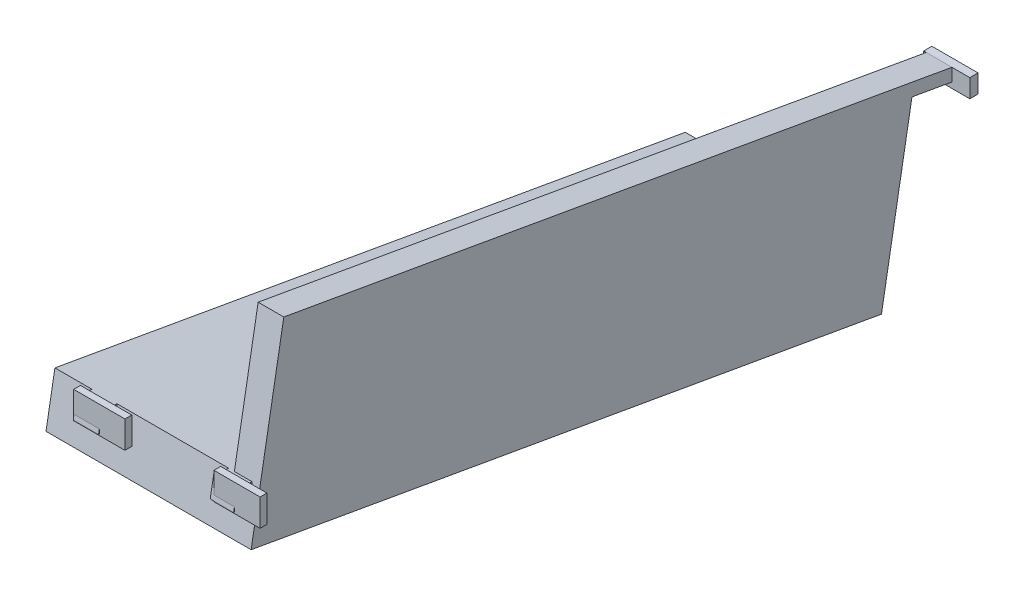
ISO-10303-21;
HEADER;
FILE_DESCRIPTION(('STEP AP214'),'2;1');
FILE_NAME('part.step','',(''),(''),'','','');
FILE_SCHEMA(('AUTOMOTIVE_DESIGN { 1 0 10303 214 1 1 1 1 }'));
ENDSEC;
DATA;
#1=APPLICATION_CONTEXT('core data for automotive mechanical design processes');
#2=APPLICATION_PROTOCOL_DEFINITION('international standard','automotive_design',2000,#1);
#3=PRODUCT_CONTEXT('',#1,'mechanical');
#4=PRODUCT('Part','Part','',(#3));
#5=PRODUCT_RELATED_PRODUCT_CATEGORY('part','',(#4));
#6=PRODUCT_DEFINITION_FORMATION('','',#4);
#7=PRODUCT_DEFINITION_CONTEXT('part definition',#1,'design');
#8=PRODUCT_DEFINITION('design','',#6,#7);
#9=PRODUCT_DEFINITION_SHAPE('','',#8);
#10=(LENGTH_UNIT() NAMED_UNIT(*) SI_UNIT(.MILLI.,.METRE.));
#11=(NAMED_UNIT(*) PLANE_ANGLE_UNIT() SI_UNIT($,.RADIAN.));
#12=(NAMED_UNIT(*) SI_UNIT($,.STERADIAN.) SOLID_ANGLE_UNIT());
#13=UNCERTAINTY_MEASURE_WITH_UNIT(LENGTH_MEASURE(1.E-05),#10,'distance_accuracy_value','');
#14=(GEOMETRIC_REPRESENTATION_CONTEXT(3) GLOBAL_UNCERTAINTY_ASSIGNED_CONTEXT((#13)) GLOBAL_UNIT_ASSIGNED_CONTEXT((#10,
#11,#12)) REPRESENTATION_CONTEXT('',''));
#15=CARTESIAN_POINT('',(0.,0.,0.));
#16=DIRECTION('',(0.,0.,1.));
#17=DIRECTION('',(1.,0.,0.));
#18=AXIS2_PLACEMENT_3D('',#15,#16,#17);
#19=CARTESIAN_POINT('',(72.3326180453818,5.20944533000809,29.5442325903662));
#20=DIRECTION('',(1.,0.,0.));
#21=DIRECTION('',(0.,0.,-1.));
#22=AXIS2_PLACEMENT_3D('',#19,#20,#21);
#23=PLANE('',#22);
#24=DIRECTION('',(0.,-0.173648177666936,-0.984807753012207));
#25=VECTOR('',#24,1.);
#26=CARTESIAN_POINT('',(72.3326180453818,-33.4961910673324,36.3690805927092));
#27=LINE('',#26,#25);
#28=CARTESIAN_POINT('',(72.3326180453818,-36.1009137323364,21.5969642975261));
#29=VERTEX_POINT('',#28);
#30=CARTESIAN_POINT('',(72.3326180453818,-38.7056363973405,6.82484800234295));
#31=VERTEX_POINT('',#30);
#32=EDGE_CURVE('E459',#29,#31,#27,.T.);
#33=ORIENTED_EDGE('',*,*,#32,.F.);
#34=DIRECTION('',(0.,1.,0.));
#35=VECTOR('',#34,1.);
#36=CARTESIAN_POINT('',(72.3326180453818,5.20944533000809,21.5969642975261));
#37=LINE('',#36,#35);
#38=CARTESIAN_POINT('',(72.3326180453818,3.80812750705137,21.5969642975261));
#39=VERTEX_POINT('',#38);
#40=EDGE_CURVE('E312',#29,#39,#37,.T.);
#41=ORIENTED_EDGE('',*,*,#40,.T.);
#42=DIRECTION('',(0.,-0.173648177666936,-0.984807753012207));
#43=VECTOR('',#42,1.);
#44=CARTESIAN_POINT('',(72.3326180453818,5.20944533000809,29.5442325903662));
#45=LINE('',#44,#43);
#46=CARTESIAN_POINT('',(72.3326180453818,0.,0.));
#47=VERTEX_POINT('',#46);
#48=EDGE_CURVE('E444',#39,#47,#45,.T.);
#49=ORIENTED_EDGE('',*,*,#48,.T.);
#50=DIRECTION('',(0.,-0.984807753012207,0.173648177666936));
#51=VECTOR('',#50,1.);
#52=CARTESIAN_POINT('',(72.3326180453818,0.,0.));
#53=LINE('',#52,#51);
#54=EDGE_CURVE('E436',#47,#31,#53,.T.);
#55=ORIENTED_EDGE('',*,*,#54,.T.);
#56=EDGE_LOOP('',(#33,#41,#49,#55));
#57=FACE_BOUND('',#56,.T.);
#58=ADVANCED_FACE('F33',(#57),#23,.F.);
#59=CARTESIAN_POINT('',(72.3326180453818,-33.4961910673324,36.3690805927092));
#60=DIRECTION('',(0.,0.984807753012207,-0.173648177666936));
#61=DIRECTION('',(0.,0.173648177666936,0.984807753012207));
#62=AXIS2_PLACEMENT_3D('',#59,#60,#61);
#63=PLANE('',#62);
#64=DIRECTION('',(0.,-0.173648177666936,-0.984807753012207));
#65=VECTOR('',#64,1.);
#66=CARTESIAN_POINT('',(121.466483363949,-33.4961910673324,36.3690805927092));
#67=LINE('',#66,#65);
#68=CARTESIAN_POINT('',(121.466483363949,-36.1009137323365,21.596964297526));
#69=VERTEX_POINT('',#68);
#70=CARTESIAN_POINT('',(121.466483363949,-38.7056363973405,6.82484800234295));
#71=VERTEX_POINT('',#70);
#72=EDGE_CURVE('E455',#69,#71,#67,.T.);
#73=ORIENTED_EDGE('',*,*,#72,.F.);
#74=DIRECTION('',(1.,0.,0.));
#75=VECTOR('',#74,1.);
#76=CARTESIAN_POINT('',(71.4664833639492,-36.1009137323364,21.5969642975261));
#77=LINE('',#76,#75);
#78=EDGE_CURVE('E56',#29,#69,#77,.T.);
#79=ORIENTED_EDGE('',*,*,#78,.F.);
#80=ORIENTED_EDGE('',*,*,#32,.T.);
#81=DIRECTION('',(1.,0.,0.));
#82=VECTOR('',#81,1.);
#83=CARTESIAN_POINT('',(72.3326180453818,-38.7056363973405,6.82484800234295));
#84=LINE('',#83,#82);
#85=EDGE_CURVE('E447',#31,#71,#84,.T.);
#86=ORIENTED_EDGE('',*,*,#85,.T.);
#87=EDGE_LOOP('',(#73,#79,#80,#86));
#88=FACE_BOUND('',#87,.T.);
#89=ADVANCED_FACE('F549',(#88),#63,.F.);
#90=CARTESIAN_POINT('',(121.466483363949,5.20944533000809,29.5442325903662));
#91=DIRECTION('',(-1.,0.,0.));
#92=DIRECTION('',(0.,0.,1.));
#93=AXIS2_PLACEMENT_3D('',#90,#91,#92);
#94=PLANE('',#93);
#95=DIRECTION('',(0.,-0.173648177666936,-0.984807753012207));
#96=VECTOR('',#95,1.);
#97=CARTESIAN_POINT('',(121.466483363949,5.20944533000809,29.5442325903662));
#98=LINE('',#97,#96);
#99=CARTESIAN_POINT('',(121.466483363949,3.80812750705142,21.5969642975261));
#100=VERTEX_POINT('',#99);
#101=CARTESIAN_POINT('',(121.466483363949,0.,0.));
#102=VERTEX_POINT('',#101);
#103=EDGE_CURVE('E453',#100,#102,#98,.T.);
#104=ORIENTED_EDGE('',*,*,#103,.F.);
#105=DIRECTION('',(0.,-1.,0.));
#106=VECTOR('',#105,1.);
#107=CARTESIAN_POINT('',(121.466483363949,5.20944533000809,21.5969642975261));
#108=LINE('',#107,#106);
#109=EDGE_CURVE('E11',#100,#69,#108,.T.);
#110=ORIENTED_EDGE('',*,*,#109,.T.);
#111=ORIENTED_EDGE('',*,*,#72,.T.);
#112=DIRECTION('',(0.,0.984807753012207,-0.173648177666936));
#113=VECTOR('',#112,1.);
#114=CARTESIAN_POINT('',(121.466483363949,0.,0.));
#115=LINE('',#114,#113);
#116=EDGE_CURVE('E440',#71,#102,#115,.T.);
#117=ORIENTED_EDGE('',*,*,#116,.T.);
#118=EDGE_LOOP('',(#104,#110,#111,#117));
#119=FACE_BOUND('',#118,.T.);
#120=ADVANCED_FACE('F543',(#119),#94,.F.);
#121=CARTESIAN_POINT('',(384.901351679084,5.2094453300081,29.5442325903662));
#122=DIRECTION('',(-1.,0.,0.));
#123=DIRECTION('',(0.,0.,1.));
#124=AXIS2_PLACEMENT_3D('',#121,#122,#123);
#125=PLANE('',#124);
#126=DIRECTION('',(0.,-0.173648177666936,-0.984807753012207));
#127=VECTOR('',#126,1.);
#128=CARTESIAN_POINT('',(384.901351679084,5.2094453300081,29.5442325903662));
#129=LINE('',#128,#127);
#130=CARTESIAN_POINT('',(384.901351679084,3.80812750705144,21.5969642975261));
#131=VERTEX_POINT('',#130);
#132=CARTESIAN_POINT('',(384.901351679084,0.,0.));
#133=VERTEX_POINT('',#132);
#134=EDGE_CURVE('E427',#131,#133,#129,.T.);
#135=ORIENTED_EDGE('',*,*,#134,.F.);
#136=DIRECTION('',(0.,-1.,0.));
#137=VECTOR('',#136,1.);
#138=CARTESIAN_POINT('',(384.901351679084,5.2094453300081,21.5969642975261));
#139=LINE('',#138,#137);
#140=CARTESIAN_POINT('',(384.901351679084,-36.1009137323364,21.5969642975261));
#141=VERTEX_POINT('',#140);
#142=EDGE_CURVE('E521',#131,#141,#139,.T.);
#143=ORIENTED_EDGE('',*,*,#142,.T.);
#144=DIRECTION('',(0.,-0.173648177666936,-0.984807753012207));
#145=VECTOR('',#144,1.);
#146=CARTESIAN_POINT('',(384.901351679084,-33.4961910673324,36.3690805927092));
#147=LINE('',#146,#145);
#148=CARTESIAN_POINT('',(384.901351679084,-38.7056363973405,6.82484800234294));
#149=VERTEX_POINT('',#148);
#150=EDGE_CURVE('E429',#141,#149,#147,.T.);
#151=ORIENTED_EDGE('',*,*,#150,.T.);
#152=DIRECTION('',(0.,0.984807753012207,-0.173648177666936));
#153=VECTOR('',#152,1.);
#154=CARTESIAN_POINT('',(384.901351679084,0.,0.));
#155=LINE('',#154,#153);
#156=EDGE_CURVE('E420',#149,#133,#155,.T.);
#157=ORIENTED_EDGE('',*,*,#156,.T.);
#158=EDGE_LOOP('',(#135,#143,#151,#157));
#159=FACE_BOUND('',#158,.T.);
#160=ADVANCED_FACE('F552',(#159),#125,.F.);
#161=CARTESIAN_POINT('',(350.,-98.4807753012209,17.3648177666936));
#162=DIRECTION('',(0.,-0.173648177666936,-0.984807753012207));
#163=DIRECTION('',(0.,0.984807753012207,-0.173648177666936));
#164=AXIS2_PLACEMENT_3D('',#161,#162,#163);
#165=PLANE('',#164);
#166=DIRECTION('',(0.,-0.984807753012207,0.173648177666936));
#167=VECTOR('',#166,1.);
#168=CARTESIAN_POINT('',(339.252878336231,0.,0.));
#169=LINE('',#168,#167);
#170=CARTESIAN_POINT('',(339.252878336231,0.,0.));
#171=VERTEX_POINT('',#170);
#172=CARTESIAN_POINT('',(339.252878336231,-38.7056363973405,6.82484800234294));
#173=VERTEX_POINT('',#172);
#174=EDGE_CURVE('E402',#171,#173,#169,.T.);
#175=ORIENTED_EDGE('',*,*,#174,.F.);
#176=DIRECTION('',(-1.,0.,0.));
#177=VECTOR('',#176,1.);
#178=CARTESIAN_POINT('',(350.,0.,0.));
#179=LINE('',#178,#177);
#180=EDGE_CURVE('E504',#171,#102,#179,.T.);
#181=ORIENTED_EDGE('',*,*,#180,.T.);
#182=ORIENTED_EDGE('',*,*,#116,.F.);
#183=ORIENTED_EDGE('',*,*,#85,.F.);
#184=ORIENTED_EDGE('',*,*,#54,.F.);
#185=CARTESIAN_POINT('',(0.,0.,0.));
#186=VERTEX_POINT('',#185);
#187=EDGE_CURVE('E494',#47,#186,#179,.T.);
#188=ORIENTED_EDGE('',*,*,#187,.T.);
#189=DIRECTION('',(0.,-0.984807753012207,0.173648177666936));
#190=VECTOR('',#189,1.);
#191=CARTESIAN_POINT('',(0.,-98.4807753012209,17.3648177666936));
#192=LINE('',#191,#190);
#193=CARTESIAN_POINT('',(0.,-98.4807753012209,17.3648177666936));
#194=VERTEX_POINT('',#193);
#195=EDGE_CURVE('E491',#186,#194,#192,.T.);
#196=ORIENTED_EDGE('',*,*,#195,.T.);
#197=DIRECTION('',(-1.,0.,0.));
#198=VECTOR('',#197,1.);
#199=CARTESIAN_POINT('',(350.,-98.4807753012209,17.3648177666936));
#200=LINE('',#199,#198);
#201=CARTESIAN_POINT('',(400.,-98.480775301221,17.364817766693));
#202=VERTEX_POINT('',#201);
#203=EDGE_CURVE('E513',#202,#194,#200,.T.);
#204=ORIENTED_EDGE('',*,*,#203,.F.);
#205=DIRECTION('',(0.,-0.984807753012208,0.17364817766693));
#206=VECTOR('',#205,1.);
#207=CARTESIAN_POINT('',(400.,-98.480775301221,17.364817766693));
#208=LINE('',#207,#206);
#209=CARTESIAN_POINT('',(400.,262.797961946476,-46.3383711663604));
#210=VERTEX_POINT('',#209);
#211=EDGE_CURVE('E479',#210,#202,#208,.T.);
#212=ORIENTED_EDGE('',*,*,#211,.F.);
#213=DIRECTION('',(-1.,0.,0.));
#214=VECTOR('',#213,1.);
#215=CARTESIAN_POINT('',(400.,262.797961946476,-46.3383711663604));
#216=LINE('',#215,#214);
#217=CARTESIAN_POINT('',(350.,262.797961946476,-46.3383711663604));
#218=VERTEX_POINT('',#217);
#219=EDGE_CURVE('E482',#210,#218,#216,.T.);
#220=ORIENTED_EDGE('',*,*,#219,.T.);
#221=DIRECTION('',(0.,-0.984807753012208,0.17364817766693));
#222=VECTOR('',#221,1.);
#223=CARTESIAN_POINT('',(350.,-98.480775301221,17.364817766693));
#224=LINE('',#223,#222);
#225=CARTESIAN_POINT('',(350.,0.,-1.17226610867137E-13));
#226=VERTEX_POINT('',#225);
#227=EDGE_CURVE('E474',#218,#226,#224,.T.);
#228=ORIENTED_EDGE('',*,*,#227,.T.);
#229=DIRECTION('',(-1.,0.,0.));
#230=VECTOR('',#229,1.);
#231=CARTESIAN_POINT('',(339.252878336231,0.,0.));
#232=LINE('',#231,#230);
#233=EDGE_CURVE('E407',#133,#226,#232,.T.);
#234=ORIENTED_EDGE('',*,*,#233,.F.);
#235=ORIENTED_EDGE('',*,*,#156,.F.);
#236=DIRECTION('',(1.,0.,0.));
#237=VECTOR('',#236,1.);
#238=CARTESIAN_POINT('',(339.252878336231,-38.7056363973405,6.82484800234295));
#239=LINE('',#238,#237);
#240=EDGE_CURVE('E417',#173,#149,#239,.T.);
#241=ORIENTED_EDGE('',*,*,#240,.F.);
#242=EDGE_LOOP('',(#175,#181,#182,#183,#184,#188,#196,#204,#212,#220,#228,#234,#235,#241));
#243=FACE_BOUND('',#242,.T.);
#244=ADVANCED_FACE('F35',(#243),#165,.F.);
#245=CARTESIAN_POINT('',(350.,-216.747655363867,-1229.23703730984));
#246=DIRECTION('',(0.,0.173648177666932,0.984807753012208));
#247=DIRECTION('',(0.,-0.984807753012208,0.173648177666932));
#248=AXIS2_PLACEMENT_3D('',#245,#246,#247);
#249=PLANE('',#248);
#250=DIRECTION('',(-1.,0.,0.));
#251=VECTOR('',#250,1.);
#252=CARTESIAN_POINT('',(400.,21.9145335988968,-1271.31962049891));
#253=LINE('',#252,#251);
#254=CARTESIAN_POINT('',(400.,21.914533598897,-1271.31962049891));
#255=VERTEX_POINT('',#254);
#256=CARTESIAN_POINT('',(350.,21.9145335988968,-1271.31962049891));
#257=VERTEX_POINT('',#256);
#258=EDGE_CURVE('E462',#255,#257,#253,.T.);
#259=ORIENTED_EDGE('',*,*,#258,.F.);
#260=DIRECTION('',(0.,0.984807753012208,-0.173648177666929));
#261=VECTOR('',#260,1.);
#262=CARTESIAN_POINT('',(400.,-315.228430665084,-1211.87221954314));
#263=LINE('',#262,#261);
#264=CARTESIAN_POINT('',(400.,-315.228430665084,-1211.87221954314));
#265=VERTEX_POINT('',#264);
#266=EDGE_CURVE('E473',#265,#255,#263,.T.);
#267=ORIENTED_EDGE('',*,*,#266,.F.);
#268=DIRECTION('',(-1.,0.,0.));
#269=VECTOR('',#268,1.);
#270=CARTESIAN_POINT('',(350.,-315.228430665084,-1211.87221954314));
#271=LINE('',#270,#269);
#272=CARTESIAN_POINT('',(0.,-315.228430665084,-1211.87221954314));
#273=VERTEX_POINT('',#272);
#274=EDGE_CURVE('E510',#265,#273,#271,.T.);
#275=ORIENTED_EDGE('',*,*,#274,.T.);
#276=DIRECTION('',(0.,0.984807753012208,-0.173648177666932));
#277=VECTOR('',#276,1.);
#278=CARTESIAN_POINT('',(0.,-216.747655363867,-1229.23703730984));
#279=LINE('',#278,#277);
#280=CARTESIAN_POINT('',(0.,-216.747655363867,-1229.23703730984));
#281=VERTEX_POINT('',#280);
#282=EDGE_CURVE('E500',#273,#281,#279,.T.);
#283=ORIENTED_EDGE('',*,*,#282,.T.);
#284=DIRECTION('',(-1.,0.,0.));
#285=VECTOR('',#284,1.);
#286=CARTESIAN_POINT('',(350.,-216.747655363867,-1229.23703730984));
#287=LINE('',#286,#285);
#288=CARTESIAN_POINT('',(350.,-216.747655363867,-1229.23703730984));
#289=VERTEX_POINT('',#288);
#290=EDGE_CURVE('E507',#289,#281,#287,.T.);
#291=ORIENTED_EDGE('',*,*,#290,.F.);
#292=DIRECTION('',(0.,0.984807753012208,-0.173648177666929));
#293=VECTOR('',#292,1.);
#294=CARTESIAN_POINT('',(350.,-315.228430665084,-1211.87221954314));
#295=LINE('',#294,#293);
#296=EDGE_CURVE('E469',#289,#257,#295,.T.);
#297=ORIENTED_EDGE('',*,*,#296,.T.);
#298=EDGE_LOOP('',(#259,#267,#275,#283,#291,#297));
#299=FACE_BOUND('',#298,.T.);
#300=ADVANCED_FACE('F890',(#299),#249,.F.);
#301=CARTESIAN_POINT('',(350.,-315.228430665084,-1211.87221954314));
#302=DIRECTION('',(0.,0.984807753012208,-0.173648177666931));
#303=DIRECTION('',(0.,0.173648177666931,0.984807753012208));
#304=AXIS2_PLACEMENT_3D('',#301,#302,#303);
#305=PLANE('',#304);
#306=DIRECTION('',(0.,-0.173648177666931,-0.984807753012208));
#307=VECTOR('',#306,1.);
#308=CARTESIAN_POINT('',(0.,-315.228430665084,-1211.87221954314));
#309=LINE('',#308,#307);
#310=EDGE_CURVE('E498',#194,#273,#309,.T.);
#311=ORIENTED_EDGE('',*,*,#310,.T.);
#312=ORIENTED_EDGE('',*,*,#274,.F.);
#313=DIRECTION('',(0.,-0.173648177666931,-0.984807753012208));
#314=VECTOR('',#313,1.);
#315=CARTESIAN_POINT('',(400.,-98.480775301221,17.364817766693));
#316=LINE('',#315,#314);
#317=EDGE_CURVE('E470',#202,#265,#316,.T.);
#318=ORIENTED_EDGE('',*,*,#317,.F.);
#319=ORIENTED_EDGE('',*,*,#203,.T.);
#320=EDGE_LOOP('',(#311,#312,#318,#319));
#321=FACE_BOUND('',#320,.T.);
#322=ADVANCED_FACE('F648',(#321),#305,.F.);
#323=CARTESIAN_POINT('',(350.,0.,0.));
#324=DIRECTION('',(0.,-0.984807753012207,0.173648177666934));
#325=DIRECTION('',(0.,-0.173648177666934,-0.984807753012208));
#326=AXIS2_PLACEMENT_3D('',#323,#324,#325);
#327=PLANE('',#326);
#328=ORIENTED_EDGE('',*,*,#48,.F.);
#329=DIRECTION('',(1.,0.,0.));
#330=VECTOR('',#329,1.);
#331=CARTESIAN_POINT('',(350.,3.80812750705137,21.5969642975261));
#332=LINE('',#331,#330);
#333=EDGE_CURVE('E309',#39,#100,#332,.T.);
#334=ORIENTED_EDGE('',*,*,#333,.T.);
#335=ORIENTED_EDGE('',*,*,#103,.T.);
#336=ORIENTED_EDGE('',*,*,#180,.F.);
#337=DIRECTION('',(0.,-0.173648177666936,-0.984807753012207));
#338=VECTOR('',#337,1.);
#339=CARTESIAN_POINT('',(339.252878336231,5.2094453300081,29.5442325903662));
#340=LINE('',#339,#338);
#341=CARTESIAN_POINT('',(339.252878336231,5.2094453300081,29.5442325903662));
#342=VERTEX_POINT('',#341);
#343=EDGE_CURVE('E414',#342,#171,#340,.T.);
#344=ORIENTED_EDGE('',*,*,#343,.F.);
#345=DIRECTION('',(-1.,0.,0.));
#346=VECTOR('',#345,1.);
#347=CARTESIAN_POINT('',(339.252878336231,5.2094453300081,29.5442325903662));
#348=LINE('',#347,#346);
#349=CARTESIAN_POINT('',(344.901351679084,5.2094453300081,29.5442325903662));
#350=VERTEX_POINT('',#349);
#351=EDGE_CURVE('E412',#350,#342,#348,.T.);
#352=ORIENTED_EDGE('',*,*,#351,.F.);
#353=DIRECTION('',(0.,0.173648177666934,0.984807753012208));
#354=VECTOR('',#353,1.);
#355=CARTESIAN_POINT('',(344.901351679084,0.,0.));
#356=LINE('',#355,#354);
#357=CARTESIAN_POINT('',(344.901351679084,3.80812750705136,21.5969642975261));
#358=VERTEX_POINT('',#357);
#359=EDGE_CURVE('E383',#358,#350,#356,.T.);
#360=ORIENTED_EDGE('',*,*,#359,.F.);
#361=DIRECTION('',(1.,0.,0.));
#362=VECTOR('',#361,1.);
#363=CARTESIAN_POINT('',(350.,3.80812750705137,21.5969642975261));
#364=LINE('',#363,#362);
#365=EDGE_CURVE('E399',#358,#131,#364,.T.);
#366=ORIENTED_EDGE('',*,*,#365,.T.);
#367=ORIENTED_EDGE('',*,*,#134,.T.);
#368=ORIENTED_EDGE('',*,*,#233,.T.);
#369=DIRECTION('',(0.,0.173648177666934,0.984807753012207));
#370=VECTOR('',#369,1.);
#371=CARTESIAN_POINT('',(350.,0.,0.));
#372=LINE('',#371,#370);
#373=EDGE_CURVE('E492',#289,#226,#372,.T.);
#374=ORIENTED_EDGE('',*,*,#373,.F.);
#375=ORIENTED_EDGE('',*,*,#290,.T.);
#376=DIRECTION('',(0.,0.173648177666934,0.984807753012207));
#377=VECTOR('',#376,1.);
#378=CARTESIAN_POINT('',(0.,0.,0.));
#379=LINE('',#378,#377);
#380=EDGE_CURVE('E495',#281,#186,#379,.T.);
#381=ORIENTED_EDGE('',*,*,#380,.T.);
#382=ORIENTED_EDGE('',*,*,#187,.F.);
#383=EDGE_LOOP('',(#328,#334,#335,#336,#344,#352,#360,#366,#367,#368,#374,#375,#381,#382));
#384=FACE_BOUND('',#383,.T.);
#385=ADVANCED_FACE('F642',(#384),#327,.F.);
#386=CARTESIAN_POINT('',(0.,0.,0.));
#387=DIRECTION('',(-1.,0.,0.));
#388=DIRECTION('',(0.,0.,1.));
#389=AXIS2_PLACEMENT_3D('',#386,#387,#388);
#390=PLANE('',#389);
#391=ORIENTED_EDGE('',*,*,#195,.F.);
#392=ORIENTED_EDGE('',*,*,#380,.F.);
#393=ORIENTED_EDGE('',*,*,#282,.F.);
#394=ORIENTED_EDGE('',*,*,#310,.F.);
#395=EDGE_LOOP('',(#391,#392,#393,#394));
#396=FACE_BOUND('',#395,.T.);
#397=ADVANCED_FACE('F647',(#396),#390,.T.);
#398=CARTESIAN_POINT('',(350.,0.,0.));
#399=DIRECTION('',(1.,0.,0.));
#400=DIRECTION('',(0.,0.,-1.));
#401=AXIS2_PLACEMENT_3D('',#398,#399,#400);
#402=PLANE('',#401);
#403=DIRECTION('',(0.,0.173648177666929,0.984807753012208));
#404=VECTOR('',#403,1.);
#405=CARTESIAN_POINT('',(350.,262.797961946476,-46.3383711663604));
#406=LINE('',#405,#404);
#407=CARTESIAN_POINT('',(350.,33.0638669252756,-1349.22516760643));
#408=VERTEX_POINT('',#407);
#409=EDGE_CURVE('E485',#408,#218,#406,.T.);
#410=ORIENTED_EDGE('',*,*,#409,.F.);
#411=DIRECTION('',(0.,-1.,0.));
#412=VECTOR('',#411,1.);
#413=CARTESIAN_POINT('',(350.,0.,-1349.22516760643));
#414=LINE('',#413,#412);
#415=CARTESIAN_POINT('',(350.,8.17768369698739,-1349.22516760643));
#416=VERTEX_POINT('',#415);
#417=EDGE_CURVE('E352',#408,#416,#414,.T.);
#418=ORIENTED_EDGE('',*,*,#417,.T.);
#419=DIRECTION('',(0.,0.173648177666932,0.984807753012208));
#420=VECTOR('',#419,1.);
#421=CARTESIAN_POINT('',(350.,6.28619760887291,-1359.95231827001));
#422=LINE('',#421,#420);
#423=EDGE_CURVE('E465',#416,#257,#422,.T.);
#424=ORIENTED_EDGE('',*,*,#423,.T.);
#425=ORIENTED_EDGE('',*,*,#296,.F.);
#426=ORIENTED_EDGE('',*,*,#373,.T.);
#427=ORIENTED_EDGE('',*,*,#227,.F.);
#428=EDGE_LOOP('',(#410,#418,#424,#425,#426,#427));
#429=FACE_BOUND('',#428,.T.);
#430=ADVANCED_FACE('F858',(#429),#402,.F.);
#431=CARTESIAN_POINT('',(400.,262.797961946476,-46.3383711663604));
#432=DIRECTION('',(0.,-0.984807753012208,0.173648177666929));
#433=DIRECTION('',(0.,-0.173648177666929,-0.984807753012208));
#434=AXIS2_PLACEMENT_3D('',#431,#432,#433);
#435=PLANE('',#434);
#436=DIRECTION('',(0.,0.173648177666929,0.984807753012208));
#437=VECTOR('',#436,1.);
#438=CARTESIAN_POINT('',(400.,262.797961946476,-46.3383711663604));
#439=LINE('',#438,#437);
#440=CARTESIAN_POINT('',(400.,33.0638669252756,-1349.22516760643));
#441=VERTEX_POINT('',#440);
#442=EDGE_CURVE('E477',#441,#210,#439,.T.);
#443=ORIENTED_EDGE('',*,*,#442,.F.);
#444=DIRECTION('',(1.,0.,0.));
#445=VECTOR('',#444,1.);
#446=CARTESIAN_POINT('',(344.901351679084,33.0638669252756,-1349.22516760643));
#447=LINE('',#446,#445);
#448=EDGE_CURVE('E344',#408,#441,#447,.T.);
#449=ORIENTED_EDGE('',*,*,#448,.F.);
#450=ORIENTED_EDGE('',*,*,#409,.T.);
#451=ORIENTED_EDGE('',*,*,#219,.F.);
#452=EDGE_LOOP('',(#443,#449,#450,#451));
#453=FACE_BOUND('',#452,.T.);
#454=ADVANCED_FACE('F847',(#453),#435,.F.);
#455=CARTESIAN_POINT('',(400.,0.,0.));
#456=DIRECTION('',(1.,0.,0.));
#457=DIRECTION('',(0.,0.,-1.));
#458=AXIS2_PLACEMENT_3D('',#455,#456,#457);
#459=PLANE('',#458);
#460=DIRECTION('',(0.,-1.,0.));
#461=VECTOR('',#460,1.);
#462=CARTESIAN_POINT('',(400.,0.,-1349.22516760643));
#463=LINE('',#462,#461);
#464=CARTESIAN_POINT('',(400.,8.17768369698739,-1349.22516760643));
#465=VERTEX_POINT('',#464);
#466=EDGE_CURVE('E343',#441,#465,#463,.T.);
#467=ORIENTED_EDGE('',*,*,#466,.F.);
#468=ORIENTED_EDGE('',*,*,#442,.T.);
#469=ORIENTED_EDGE('',*,*,#211,.T.);
#470=ORIENTED_EDGE('',*,*,#317,.T.);
#471=ORIENTED_EDGE('',*,*,#266,.T.);
#472=DIRECTION('',(0.,0.173648177666932,0.984807753012208));
#473=VECTOR('',#472,1.);
#474=CARTESIAN_POINT('',(400.,6.28619760887291,-1359.95231827001));
#475=LINE('',#474,#473);
#476=EDGE_CURVE('E467',#465,#255,#475,.T.);
#477=ORIENTED_EDGE('',*,*,#476,.F.);
#478=EDGE_LOOP('',(#467,#468,#469,#470,#471,#477));
#479=FACE_BOUND('',#478,.T.);
#480=ADVANCED_FACE('F837',(#479),#459,.T.);
#481=CARTESIAN_POINT('',(400.,6.28619760887291,-1359.95231827001));
#482=DIRECTION('',(0.,0.984807753012208,-0.173648177666932));
#483=DIRECTION('',(0.,0.173648177666932,0.984807753012208));
#484=AXIS2_PLACEMENT_3D('',#481,#482,#483);
#485=PLANE('',#484);
#486=ORIENTED_EDGE('',*,*,#423,.F.);
#487=DIRECTION('',(1.,0.,0.));
#488=VECTOR('',#487,1.);
#489=CARTESIAN_POINT('',(400.,8.17768369698739,-1349.22516760643));
#490=LINE('',#489,#488);
#491=EDGE_CURVE('E524',#416,#465,#490,.T.);
#492=ORIENTED_EDGE('',*,*,#491,.T.);
#493=ORIENTED_EDGE('',*,*,#476,.T.);
#494=ORIENTED_EDGE('',*,*,#258,.T.);
#495=EDGE_LOOP('',(#486,#492,#493,#494));
#496=FACE_BOUND('',#495,.T.);
#497=ADVANCED_FACE('F832',(#496),#485,.F.);
#498=CARTESIAN_POINT('',(339.252878336231,5.2094453300081,29.5442325903662));
#499=DIRECTION('',(1.,0.,0.));
#500=DIRECTION('',(0.,0.,-1.));
#501=AXIS2_PLACEMENT_3D('',#498,#499,#500);
#502=PLANE('',#501);
#503=ORIENTED_EDGE('',*,*,#174,.T.);
#504=DIRECTION('',(0.,-0.173648177666936,-0.984807753012207));
#505=VECTOR('',#504,1.);
#506=CARTESIAN_POINT('',(339.252878336231,-33.4961910673324,36.3690805927092));
#507=LINE('',#506,#505);
#508=CARTESIAN_POINT('',(339.252878336231,-33.4961910673324,36.3690805927092));
#509=VERTEX_POINT('',#508);
#510=EDGE_CURVE('E433',#509,#173,#507,.T.);
#511=ORIENTED_EDGE('',*,*,#510,.F.);
#512=DIRECTION('',(0.,-0.984807753012207,0.173648177666936));
#513=VECTOR('',#512,1.);
#514=CARTESIAN_POINT('',(339.252878336231,5.2094453300081,29.5442325903662));
#515=LINE('',#514,#513);
#516=EDGE_CURVE('E403',#342,#509,#515,.T.);
#517=ORIENTED_EDGE('',*,*,#516,.F.);
#518=ORIENTED_EDGE('',*,*,#343,.T.);
#519=EDGE_LOOP('',(#503,#511,#517,#518));
#520=FACE_BOUND('',#519,.T.);
#521=ADVANCED_FACE('F825',(#520),#502,.F.);
#522=CARTESIAN_POINT('',(339.252878336231,-33.4961910673324,36.3690805927092));
#523=DIRECTION('',(0.,0.984807753012207,-0.173648177666936));
#524=DIRECTION('',(0.,0.173648177666936,0.984807753012207));
#525=AXIS2_PLACEMENT_3D('',#522,#523,#524);
#526=PLANE('',#525);
#527=ORIENTED_EDGE('',*,*,#150,.F.);
#528=DIRECTION('',(1.,0.,0.));
#529=VECTOR('',#528,1.);
#530=CARTESIAN_POINT('',(344.901351679084,-36.1009137323364,21.5969642975261));
#531=LINE('',#530,#529);
#532=CARTESIAN_POINT('',(344.901351679084,-36.1009137323364,21.5969642975261));
#533=VERTEX_POINT('',#532);
#534=EDGE_CURVE('E380',#533,#141,#531,.T.);
#535=ORIENTED_EDGE('',*,*,#534,.F.);
#536=DIRECTION('',(0.,-0.173648177666936,-0.984807753012207));
#537=VECTOR('',#536,1.);
#538=CARTESIAN_POINT('',(344.901351679084,-33.4961910673324,36.3690805927092));
#539=LINE('',#538,#537);
#540=CARTESIAN_POINT('',(344.901351679084,-33.7642537882558,34.8488213570192));
#541=VERTEX_POINT('',#540);
#542=EDGE_CURVE('E391',#541,#533,#539,.T.);
#543=ORIENTED_EDGE('',*,*,#542,.F.);
#544=DIRECTION('',(1.,0.,0.));
#545=VECTOR('',#544,1.);
#546=CARTESIAN_POINT('',(339.252878336231,-33.7642537882558,34.8488213570192));
#547=LINE('',#546,#545);
#548=CARTESIAN_POINT('',(384.901351679084,-33.7642537882558,34.8488213570192));
#549=VERTEX_POINT('',#548);
#550=EDGE_CURVE('E396',#541,#549,#547,.T.);
#551=ORIENTED_EDGE('',*,*,#550,.T.);
#552=CARTESIAN_POINT('',(384.901351679084,-33.4961910673324,36.3690805927092));
#553=VERTEX_POINT('',#552);
#554=EDGE_CURVE('E430',#553,#549,#147,.T.);
#555=ORIENTED_EDGE('',*,*,#554,.F.);
#556=DIRECTION('',(1.,0.,0.));
#557=VECTOR('',#556,1.);
#558=CARTESIAN_POINT('',(339.252878336231,-33.4961910673324,36.3690805927092));
#559=LINE('',#558,#557);
#560=EDGE_CURVE('E406',#509,#553,#559,.T.);
#561=ORIENTED_EDGE('',*,*,#560,.F.);
#562=ORIENTED_EDGE('',*,*,#510,.T.);
#563=ORIENTED_EDGE('',*,*,#240,.T.);
#564=EDGE_LOOP('',(#527,#535,#543,#551,#555,#561,#562,#563));
#565=FACE_BOUND('',#564,.T.);
#566=ADVANCED_FACE('F815',(#565),#526,.F.);
#567=ORIENTED_EDGE('',*,*,#554,.T.);
#568=DIRECTION('',(0.,1.,0.));
#569=VECTOR('',#568,1.);
#570=CARTESIAN_POINT('',(384.901351679084,5.2094453300081,34.8488213570192));
#571=LINE('',#570,#569);
#572=CARTESIAN_POINT('',(384.901351679084,-24.8743725028585,34.8488213570192));
#573=VERTEX_POINT('',#572);
#574=EDGE_CURVE('E393',#549,#573,#571,.T.);
#575=ORIENTED_EDGE('',*,*,#574,.T.);
#576=DIRECTION('',(0.,0.984807753012207,-0.173648177666936));
#577=VECTOR('',#576,1.);
#578=CARTESIAN_POINT('',(384.901351679084,5.2094453300081,29.5442325903662));
#579=LINE('',#578,#577);
#580=EDGE_CURVE('E409',#553,#573,#579,.T.);
#581=ORIENTED_EDGE('',*,*,#580,.F.);
#582=EDGE_LOOP('',(#567,#575,#581));
#583=FACE_BOUND('',#582,.T.);
#584=ADVANCED_FACE('F805',(#583),#125,.F.);
#585=CARTESIAN_POINT('',(0.,5.20944533000808,29.5442325903662));
#586=DIRECTION('',(0.,0.173648177666936,0.984807753012207));
#587=DIRECTION('',(0.,-0.984807753012207,0.173648177666936));
#588=AXIS2_PLACEMENT_3D('',#585,#586,#587);
#589=PLANE('',#588);
#590=DIRECTION('',(1.,0.,0.));
#591=VECTOR('',#590,1.);
#592=CARTESIAN_POINT('',(0.,-24.8743725028585,34.8488213570192));
#593=LINE('',#592,#591);
#594=CARTESIAN_POINT('',(344.901351679084,-24.8743725028588,34.8488213570193));
#595=VERTEX_POINT('',#594);
#596=EDGE_CURVE('E519',#595,#573,#593,.T.);
#597=ORIENTED_EDGE('',*,*,#596,.F.);
#598=DIRECTION('',(0.,0.984807753012207,-0.173648177666936));
#599=VECTOR('',#598,1.);
#600=CARTESIAN_POINT('',(344.901351679084,5.20944533000808,29.5442325903662));
#601=LINE('',#600,#599);
#602=EDGE_CURVE('E516',#595,#350,#601,.T.);
#603=ORIENTED_EDGE('',*,*,#602,.T.);
#604=ORIENTED_EDGE('',*,*,#351,.T.);
#605=ORIENTED_EDGE('',*,*,#516,.T.);
#606=ORIENTED_EDGE('',*,*,#560,.T.);
#607=ORIENTED_EDGE('',*,*,#580,.T.);
#608=EDGE_LOOP('',(#597,#603,#604,#605,#606,#607));
#609=FACE_BOUND('',#608,.T.);
#610=ADVANCED_FACE('F794',(#609),#589,.T.);
#611=CARTESIAN_POINT('',(344.901351679084,-36.1009137323364,21.5969642975261));
#612=DIRECTION('',(0.,0.,-1.));
#613=DIRECTION('',(-1.,0.,0.));
#614=AXIS2_PLACEMENT_3D('',#611,#612,#613);
#615=PLANE('',#614);
#616=ORIENTED_EDGE('',*,*,#365,.F.);
#617=DIRECTION('',(0.,1.,0.));
#618=VECTOR('',#617,1.);
#619=CARTESIAN_POINT('',(344.901351679084,-36.1009137323364,21.5969642975261));
#620=LINE('',#619,#618);
#621=CARTESIAN_POINT('',(344.901351679084,16.8907112224034,21.5969642975261));
#622=VERTEX_POINT('',#621);
#623=EDGE_CURVE('E367',#358,#622,#620,.T.);
#624=ORIENTED_EDGE('',*,*,#623,.T.);
#625=DIRECTION('',(1.,0.,0.));
#626=VECTOR('',#625,1.);
#627=CARTESIAN_POINT('',(344.901351679084,16.8907112224034,21.5969642975261));
#628=LINE('',#627,#626);
#629=CARTESIAN_POINT('',(434.901351679084,16.8907112224034,21.5969642975261));
#630=VERTEX_POINT('',#629);
#631=EDGE_CURVE('E379',#622,#630,#628,.T.);
#632=ORIENTED_EDGE('',*,*,#631,.T.);
#633=DIRECTION('',(0.,1.,0.));
#634=VECTOR('',#633,1.);
#635=CARTESIAN_POINT('',(434.901351679084,-36.1009137323364,21.5969642975261));
#636=LINE('',#635,#634);
#637=CARTESIAN_POINT('',(434.901351679084,-36.1009137323364,21.5969642975261));
#638=VERTEX_POINT('',#637);
#639=EDGE_CURVE('E355',#638,#630,#636,.T.);
#640=ORIENTED_EDGE('',*,*,#639,.F.);
#641=EDGE_CURVE('E384',#141,#638,#531,.T.);
#642=ORIENTED_EDGE('',*,*,#641,.F.);
#643=ORIENTED_EDGE('',*,*,#142,.F.);
#644=EDGE_LOOP('',(#616,#624,#632,#640,#642,#643));
#645=FACE_BOUND('',#644,.T.);
#646=ADVANCED_FACE('F784',(#645),#615,.T.);
#647=CARTESIAN_POINT('',(344.901351679084,-36.1009137323364,34.8488213570192));
#648=DIRECTION('',(0.,0.,1.));
#649=DIRECTION('',(1.,0.,0.));
#650=AXIS2_PLACEMENT_3D('',#647,#648,#649);
#651=PLANE('',#650);
#652=ORIENTED_EDGE('',*,*,#550,.F.);
#653=DIRECTION('',(0.,-1.,0.));
#654=VECTOR('',#653,1.);
#655=CARTESIAN_POINT('',(344.901351679084,-36.1009137323364,34.8488213570192));
#656=LINE('',#655,#654);
#657=CARTESIAN_POINT('',(344.901351679084,-36.1009137323364,34.8488213570192));
#658=VERTEX_POINT('',#657);
#659=EDGE_CURVE('E372',#541,#658,#656,.T.);
#660=ORIENTED_EDGE('',*,*,#659,.T.);
#661=DIRECTION('',(1.,0.,0.));
#662=VECTOR('',#661,1.);
#663=CARTESIAN_POINT('',(344.901351679084,-36.1009137323364,34.8488213570192));
#664=LINE('',#663,#662);
#665=CARTESIAN_POINT('',(434.901351679084,-36.1009137323364,34.8488213570192));
#666=VERTEX_POINT('',#665);
#667=EDGE_CURVE('E385',#658,#666,#664,.T.);
#668=ORIENTED_EDGE('',*,*,#667,.T.);
#669=DIRECTION('',(0.,-1.,0.));
#670=VECTOR('',#669,1.);
#671=CARTESIAN_POINT('',(434.901351679084,-36.1009137323364,34.8488213570192));
#672=LINE('',#671,#670);
#673=CARTESIAN_POINT('',(434.901351679084,16.8907112224034,34.8488213570192));
#674=VERTEX_POINT('',#673);
#675=EDGE_CURVE('E361',#674,#666,#672,.T.);
#676=ORIENTED_EDGE('',*,*,#675,.F.);
#677=DIRECTION('',(1.,0.,0.));
#678=VECTOR('',#677,1.);
#679=CARTESIAN_POINT('',(344.901351679084,16.8907112224034,34.8488213570192));
#680=LINE('',#679,#678);
#681=CARTESIAN_POINT('',(344.901351679084,16.8907112224034,34.8488213570192));
#682=VERTEX_POINT('',#681);
#683=EDGE_CURVE('E387',#682,#674,#680,.T.);
#684=ORIENTED_EDGE('',*,*,#683,.F.);
#685=EDGE_CURVE('E373',#682,#595,#656,.T.);
#686=ORIENTED_EDGE('',*,*,#685,.T.);
#687=ORIENTED_EDGE('',*,*,#596,.T.);
#688=ORIENTED_EDGE('',*,*,#574,.F.);
#689=EDGE_LOOP('',(#652,#660,#668,#676,#684,#686,#687,#688));
#690=FACE_BOUND('',#689,.T.);
#691=ADVANCED_FACE('F775',(#690),#651,.T.);
#692=CARTESIAN_POINT('',(344.901351679084,0.,0.));
#693=DIRECTION('',(1.,0.,0.));
#694=DIRECTION('',(0.,0.,-1.));
#695=AXIS2_PLACEMENT_3D('',#692,#693,#694);
#696=PLANE('',#695);
#697=ORIENTED_EDGE('',*,*,#659,.F.);
#698=ORIENTED_EDGE('',*,*,#542,.T.);
#699=DIRECTION('',(0.,0.,-1.));
#700=VECTOR('',#699,1.);
#701=CARTESIAN_POINT('',(344.901351679084,-36.1009137323364,21.5969642975261));
#702=LINE('',#701,#700);
#703=EDGE_CURVE('E376',#658,#533,#702,.T.);
#704=ORIENTED_EDGE('',*,*,#703,.F.);
#705=EDGE_LOOP('',(#697,#698,#704));
#706=FACE_BOUND('',#705,.T.);
#707=ADVANCED_FACE('F765',(#706),#696,.F.);
#708=ORIENTED_EDGE('',*,*,#623,.F.);
#709=ORIENTED_EDGE('',*,*,#359,.T.);
#710=ORIENTED_EDGE('',*,*,#602,.F.);
#711=ORIENTED_EDGE('',*,*,#685,.F.);
#712=DIRECTION('',(0.,0.,1.));
#713=VECTOR('',#712,1.);
#714=CARTESIAN_POINT('',(344.901351679084,16.8907112224034,21.5969642975261));
#715=LINE('',#714,#713);
#716=EDGE_CURVE('E369',#622,#682,#715,.T.);
#717=ORIENTED_EDGE('',*,*,#716,.F.);
#718=EDGE_LOOP('',(#708,#709,#710,#711,#717));
#719=FACE_BOUND('',#718,.T.);
#720=ADVANCED_FACE('F755',(#719),#696,.F.);
#721=CARTESIAN_POINT('',(344.901351679084,-36.1009137323364,21.5969642975261));
#722=DIRECTION('',(0.,-1.,0.));
#723=DIRECTION('',(0.,0.,-1.));
#724=AXIS2_PLACEMENT_3D('',#721,#722,#723);
#725=PLANE('',#724);
#726=ORIENTED_EDGE('',*,*,#534,.T.);
#727=ORIENTED_EDGE('',*,*,#641,.T.);
#728=DIRECTION('',(0.,0.,-1.));
#729=VECTOR('',#728,1.);
#730=CARTESIAN_POINT('',(434.901351679084,-36.1009137323364,21.5969642975261));
#731=LINE('',#730,#729);
#732=EDGE_CURVE('E364',#666,#638,#731,.T.);
#733=ORIENTED_EDGE('',*,*,#732,.F.);
#734=ORIENTED_EDGE('',*,*,#667,.F.);
#735=ORIENTED_EDGE('',*,*,#703,.T.);
#736=EDGE_LOOP('',(#726,#727,#733,#734,#735));
#737=FACE_BOUND('',#736,.T.);
#738=ADVANCED_FACE('F745',(#737),#725,.T.);
#739=CARTESIAN_POINT('',(344.901351679084,16.8907112224034,21.5969642975261));
#740=DIRECTION('',(0.,1.,0.));
#741=DIRECTION('',(0.,0.,1.));
#742=AXIS2_PLACEMENT_3D('',#739,#740,#741);
#743=PLANE('',#742);
#744=ORIENTED_EDGE('',*,*,#683,.T.);
#745=DIRECTION('',(0.,0.,1.));
#746=VECTOR('',#745,1.);
#747=CARTESIAN_POINT('',(434.901351679084,16.8907112224034,21.5969642975261));
#748=LINE('',#747,#746);
#749=EDGE_CURVE('E358',#630,#674,#748,.T.);
#750=ORIENTED_EDGE('',*,*,#749,.F.);
#751=ORIENTED_EDGE('',*,*,#631,.F.);
#752=ORIENTED_EDGE('',*,*,#716,.T.);
#753=EDGE_LOOP('',(#744,#750,#751,#752));
#754=FACE_BOUND('',#753,.T.);
#755=ADVANCED_FACE('F735',(#754),#743,.T.);
#756=CARTESIAN_POINT('',(434.901351679084,0.,0.));
#757=DIRECTION('',(1.,0.,0.));
#758=DIRECTION('',(0.,0.,-1.));
#759=AXIS2_PLACEMENT_3D('',#756,#757,#758);
#760=PLANE('',#759);
#761=ORIENTED_EDGE('',*,*,#639,.T.);
#762=ORIENTED_EDGE('',*,*,#749,.T.);
#763=ORIENTED_EDGE('',*,*,#675,.T.);
#764=ORIENTED_EDGE('',*,*,#732,.T.);
#765=EDGE_LOOP('',(#761,#762,#763,#764));
#766=FACE_BOUND('',#765,.T.);
#767=ADVANCED_FACE('F725',(#766),#760,.T.);
#768=CARTESIAN_POINT('',(344.901351679084,33.0638669252756,-1349.22516760643));
#769=DIRECTION('',(0.,0.,1.));
#770=DIRECTION('',(1.,0.,0.));
#771=AXIS2_PLACEMENT_3D('',#768,#769,#770);
#772=PLANE('',#771);
#773=ORIENTED_EDGE('',*,*,#417,.F.);
#774=CARTESIAN_POINT('',(344.901351679084,33.0638669252756,-1349.22516760643));
#775=VERTEX_POINT('',#774);
#776=EDGE_CURVE('E340',#775,#408,#447,.T.);
#777=ORIENTED_EDGE('',*,*,#776,.F.);
#778=DIRECTION('',(0.,-1.,0.));
#779=VECTOR('',#778,1.);
#780=CARTESIAN_POINT('',(344.901351679084,33.0638669252756,-1349.22516760643));
#781=LINE('',#780,#779);
#782=CARTESIAN_POINT('',(344.901351679084,-2.76592011522794,-1349.22516760643));
#783=VERTEX_POINT('',#782);
#784=EDGE_CURVE('E327',#775,#783,#781,.T.);
#785=ORIENTED_EDGE('',*,*,#784,.T.);
#786=DIRECTION('',(1.,0.,0.));
#787=VECTOR('',#786,1.);
#788=CARTESIAN_POINT('',(344.901351679084,-2.76592011522794,-1349.22516760643));
#789=LINE('',#788,#787);
#790=CARTESIAN_POINT('',(434.901351679084,-2.76592011522794,-1349.22516760643));
#791=VERTEX_POINT('',#790);
#792=EDGE_CURVE('E339',#783,#791,#789,.T.);
#793=ORIENTED_EDGE('',*,*,#792,.T.);
#794=DIRECTION('',(0.,-1.,0.));
#795=VECTOR('',#794,1.);
#796=CARTESIAN_POINT('',(434.901351679084,33.0638669252756,-1349.22516760643));
#797=LINE('',#796,#795);
#798=CARTESIAN_POINT('',(434.901351679084,33.0638669252756,-1349.22516760643));
#799=VERTEX_POINT('',#798);
#800=EDGE_CURVE('E315',#799,#791,#797,.T.);
#801=ORIENTED_EDGE('',*,*,#800,.F.);
#802=EDGE_CURVE('E345',#441,#799,#447,.T.);
#803=ORIENTED_EDGE('',*,*,#802,.F.);
#804=ORIENTED_EDGE('',*,*,#466,.T.);
#805=ORIENTED_EDGE('',*,*,#491,.F.);
#806=EDGE_LOOP('',(#773,#777,#785,#793,#801,#803,#804,#805));
#807=FACE_BOUND('',#806,.T.);
#808=ADVANCED_FACE('F715',(#807),#772,.T.);
#809=CARTESIAN_POINT('',(344.901351679084,33.0638669252756,-1349.22516760643));
#810=DIRECTION('',(0.,1.,0.));
#811=DIRECTION('',(0.,0.,1.));
#812=AXIS2_PLACEMENT_3D('',#809,#810,#811);
#813=PLANE('',#812);
#814=ORIENTED_EDGE('',*,*,#776,.T.);
#815=ORIENTED_EDGE('',*,*,#448,.T.);
#816=ORIENTED_EDGE('',*,*,#802,.T.);
#817=DIRECTION('',(0.,0.,1.));
#818=VECTOR('',#817,1.);
#819=CARTESIAN_POINT('',(434.901351679084,33.0638669252756,-1349.22516760643));
#820=LINE('',#819,#818);
#821=CARTESIAN_POINT('',(434.901351679084,33.0638669252756,-1365.17645168964));
#822=VERTEX_POINT('',#821);
#823=EDGE_CURVE('E324',#822,#799,#820,.T.);
#824=ORIENTED_EDGE('',*,*,#823,.F.);
#825=DIRECTION('',(1.,0.,0.));
#826=VECTOR('',#825,1.);
#827=CARTESIAN_POINT('',(344.901351679084,33.0638669252756,-1365.17645168964));
#828=LINE('',#827,#826);
#829=CARTESIAN_POINT('',(344.901351679084,33.0638669252756,-1365.17645168964));
#830=VERTEX_POINT('',#829);
#831=EDGE_CURVE('E346',#830,#822,#828,.T.);
#832=ORIENTED_EDGE('',*,*,#831,.F.);
#833=DIRECTION('',(0.,0.,1.));
#834=VECTOR('',#833,1.);
#835=CARTESIAN_POINT('',(344.901351679084,33.0638669252756,-1349.22516760643));
#836=LINE('',#835,#834);
#837=EDGE_CURVE('E336',#830,#775,#836,.T.);
#838=ORIENTED_EDGE('',*,*,#837,.T.);
#839=EDGE_LOOP('',(#814,#815,#816,#824,#832,#838));
#840=FACE_BOUND('',#839,.T.);
#841=ADVANCED_FACE('F705',(#840),#813,.T.);
#842=CARTESIAN_POINT('',(344.901351679084,33.0638669252756,-1365.17645168964));
#843=DIRECTION('',(0.,0.,-1.));
#844=DIRECTION('',(-1.,0.,0.));
#845=AXIS2_PLACEMENT_3D('',#842,#843,#844);
#846=PLANE('',#845);
#847=ORIENTED_EDGE('',*,*,#831,.T.);
#848=DIRECTION('',(0.,1.,0.));
#849=VECTOR('',#848,1.);
#850=CARTESIAN_POINT('',(434.901351679084,33.0638669252756,-1365.17645168964));
#851=LINE('',#850,#849);
#852=CARTESIAN_POINT('',(434.901351679084,-2.76592011522794,-1365.17645168964));
#853=VERTEX_POINT('',#852);
#854=EDGE_CURVE('E321',#853,#822,#851,.T.);
#855=ORIENTED_EDGE('',*,*,#854,.F.);
#856=DIRECTION('',(1.,0.,0.));
#857=VECTOR('',#856,1.);
#858=CARTESIAN_POINT('',(344.901351679084,-2.76592011522794,-1365.17645168964));
#859=LINE('',#858,#857);
#860=CARTESIAN_POINT('',(344.901351679084,-2.76592011522794,-1365.17645168964));
#861=VERTEX_POINT('',#860);
#862=EDGE_CURVE('E348',#861,#853,#859,.T.);
#863=ORIENTED_EDGE('',*,*,#862,.F.);
#864=DIRECTION('',(0.,1.,0.));
#865=VECTOR('',#864,1.);
#866=CARTESIAN_POINT('',(344.901351679084,33.0638669252756,-1365.17645168964));
#867=LINE('',#866,#865);
#868=EDGE_CURVE('E333',#861,#830,#867,.T.);
#869=ORIENTED_EDGE('',*,*,#868,.T.);
#870=EDGE_LOOP('',(#847,#855,#863,#869));
#871=FACE_BOUND('',#870,.T.);
#872=ADVANCED_FACE('F695',(#871),#846,.T.);
#873=CARTESIAN_POINT('',(344.901351679084,-2.76592011522794,-1349.22516760643));
#874=DIRECTION('',(0.,-1.,0.));
#875=DIRECTION('',(0.,0.,-1.));
#876=AXIS2_PLACEMENT_3D('',#873,#874,#875);
#877=PLANE('',#876);
#878=ORIENTED_EDGE('',*,*,#862,.T.);
#879=DIRECTION('',(0.,0.,-1.));
#880=VECTOR('',#879,1.);
#881=CARTESIAN_POINT('',(434.901351679084,-2.76592011522794,-1349.22516760643));
#882=LINE('',#881,#880);
#883=EDGE_CURVE('E318',#791,#853,#882,.T.);
#884=ORIENTED_EDGE('',*,*,#883,.F.);
#885=ORIENTED_EDGE('',*,*,#792,.F.);
#886=DIRECTION('',(0.,0.,-1.));
#887=VECTOR('',#886,1.);
#888=CARTESIAN_POINT('',(344.901351679084,-2.76592011522794,-1349.22516760643));
#889=LINE('',#888,#887);
#890=EDGE_CURVE('E330',#783,#861,#889,.T.);
#891=ORIENTED_EDGE('',*,*,#890,.T.);
#892=EDGE_LOOP('',(#878,#884,#885,#891));
#893=FACE_BOUND('',#892,.T.);
#894=ADVANCED_FACE('F685',(#893),#877,.T.);
#895=CARTESIAN_POINT('',(344.901351679084,0.,0.));
#896=DIRECTION('',(1.,0.,0.));
#897=DIRECTION('',(0.,0.,-1.));
#898=AXIS2_PLACEMENT_3D('',#895,#896,#897);
#899=PLANE('',#898);
#900=ORIENTED_EDGE('',*,*,#784,.F.);
#901=ORIENTED_EDGE('',*,*,#837,.F.);
#902=ORIENTED_EDGE('',*,*,#868,.F.);
#903=ORIENTED_EDGE('',*,*,#890,.F.);
#904=EDGE_LOOP('',(#900,#901,#902,#903));
#905=FACE_BOUND('',#904,.T.);
#906=ADVANCED_FACE('F675',(#905),#899,.F.);
#907=CARTESIAN_POINT('',(434.901351679084,0.,0.));
#908=DIRECTION('',(1.,0.,0.));
#909=DIRECTION('',(0.,0.,-1.));
#910=AXIS2_PLACEMENT_3D('',#907,#908,#909);
#911=PLANE('',#910);
#912=ORIENTED_EDGE('',*,*,#800,.T.);
#913=ORIENTED_EDGE('',*,*,#883,.T.);
#914=ORIENTED_EDGE('',*,*,#854,.T.);
#915=ORIENTED_EDGE('',*,*,#823,.T.);
#916=EDGE_LOOP('',(#912,#913,#914,#915));
#917=FACE_BOUND('',#916,.T.);
#918=ADVANCED_FACE('F635',(#917),#911,.T.);
#919=CARTESIAN_POINT('',(71.4664833639492,-36.1009137323364,21.5969642975261));
#920=DIRECTION('',(0.,0.,-1.));
#921=DIRECTION('',(-1.,0.,0.));
#922=AXIS2_PLACEMENT_3D('',#919,#920,#921);
#923=PLANE('',#922);
#924=ORIENTED_EDGE('',*,*,#40,.F.);
#925=CARTESIAN_POINT('',(71.4664833639492,-36.1009137323364,21.5969642975261));
#926=VERTEX_POINT('',#925);
#927=EDGE_CURVE('E297',#926,#29,#77,.T.);
#928=ORIENTED_EDGE('',*,*,#927,.F.);
#929=DIRECTION('',(0.,1.,0.));
#930=VECTOR('',#929,1.);
#931=CARTESIAN_POINT('',(71.4664833639492,-36.1009137323364,21.5969642975261));
#932=LINE('',#931,#930);
#933=CARTESIAN_POINT('',(71.4664833639492,16.8907112224034,21.5969642975261));
#934=VERTEX_POINT('',#933);
#935=EDGE_CURVE('E266',#926,#934,#932,.T.);
#936=ORIENTED_EDGE('',*,*,#935,.T.);
#937=DIRECTION('',(1.,0.,0.));
#938=VECTOR('',#937,1.);
#939=CARTESIAN_POINT('',(71.4664833639492,16.8907112224034,21.5969642975261));
#940=LINE('',#939,#938);
#941=CARTESIAN_POINT('',(171.466483363949,16.8907112224034,21.5969642975261));
#942=VERTEX_POINT('',#941);
#943=EDGE_CURVE('E260',#934,#942,#940,.T.);
#944=ORIENTED_EDGE('',*,*,#943,.T.);
#945=DIRECTION('',(0.,1.,0.));
#946=VECTOR('',#945,1.);
#947=CARTESIAN_POINT('',(171.466483363949,-36.1009137323364,21.5969642975261));
#948=LINE('',#947,#946);
#949=CARTESIAN_POINT('',(171.466483363949,-36.1009137323364,21.5969642975261));
#950=VERTEX_POINT('',#949);
#951=EDGE_CURVE('E264',#950,#942,#948,.T.);
#952=ORIENTED_EDGE('',*,*,#951,.F.);
#953=EDGE_CURVE('E300',#69,#950,#77,.T.);
#954=ORIENTED_EDGE('',*,*,#953,.F.);
#955=ORIENTED_EDGE('',*,*,#109,.F.);
#956=ORIENTED_EDGE('',*,*,#333,.F.);
#957=EDGE_LOOP('',(#924,#928,#936,#944,#952,#954,#955,#956));
#958=FACE_BOUND('',#957,.T.);
#959=ADVANCED_FACE('F262',(#958),#923,.T.);
#960=CARTESIAN_POINT('',(71.4664833639492,-36.1009137323364,34.8488213570192));
#961=DIRECTION('',(0.,0.,1.));
#962=DIRECTION('',(1.,0.,0.));
#963=AXIS2_PLACEMENT_3D('',#960,#961,#962);
#964=PLANE('',#963);
#965=DIRECTION('',(1.,0.,0.));
#966=VECTOR('',#965,1.);
#967=CARTESIAN_POINT('',(71.4664833639492,-36.1009137323364,34.8488213570192));
#968=LINE('',#967,#966);
#969=CARTESIAN_POINT('',(71.4664833639492,-36.1009137323364,34.8488213570192));
#970=VERTEX_POINT('',#969);
#971=CARTESIAN_POINT('',(171.466483363949,-36.1009137323364,34.8488213570192));
#972=VERTEX_POINT('',#971);
#973=EDGE_CURVE('E301',#970,#972,#968,.T.);
#974=ORIENTED_EDGE('',*,*,#973,.T.);
#975=DIRECTION('',(0.,-1.,0.));
#976=VECTOR('',#975,1.);
#977=CARTESIAN_POINT('',(171.466483363949,-36.1009137323364,34.8488213570192));
#978=LINE('',#977,#976);
#979=CARTESIAN_POINT('',(171.466483363949,16.8907112224034,34.8488213570192));
#980=VERTEX_POINT('',#979);
#981=EDGE_CURVE('E279',#980,#972,#978,.T.);
#982=ORIENTED_EDGE('',*,*,#981,.F.);
#983=DIRECTION('',(1.,0.,0.));
#984=VECTOR('',#983,1.);
#985=CARTESIAN_POINT('',(71.4664833639492,16.8907112224034,34.8488213570192));
#986=LINE('',#985,#984);
#987=CARTESIAN_POINT('',(71.4664833639492,16.8907112224034,34.8488213570192));
#988=VERTEX_POINT('',#987);
#989=EDGE_CURVE('E270',#988,#980,#986,.T.);
#990=ORIENTED_EDGE('',*,*,#989,.F.);
#991=DIRECTION('',(0.,-1.,0.));
#992=VECTOR('',#991,1.);
#993=CARTESIAN_POINT('',(71.4664833639492,-36.1009137323364,34.8488213570192));
#994=LINE('',#993,#992);
#995=EDGE_CURVE('E292',#988,#970,#994,.T.);
#996=ORIENTED_EDGE('',*,*,#995,.T.);
#997=EDGE_LOOP('',(#974,#982,#990,#996));
#998=FACE_BOUND('',#997,.T.);
#999=DIRECTION('',(0.,-1.,0.));
#1000=VECTOR('',#999,1.);
#1001=CARTESIAN_POINT('',(72.3326180453818,5.20944533000809,34.8488213570192));
#1002=LINE('',#1001,#1000);
#1003=CARTESIAN_POINT('',(72.3326180453818,-24.8743725028585,34.8488213570192));
#1004=VERTEX_POINT('',#1003);
#1005=CARTESIAN_POINT('',(72.3326180453818,-33.7642537882558,34.8488213570192));
#1006=VERTEX_POINT('',#1005);
#1007=EDGE_CURVE('E48',#1004,#1006,#1002,.T.);
#1008=ORIENTED_EDGE('',*,*,#1007,.F.);
#1009=DIRECTION('',(1.,0.,0.));
#1010=VECTOR('',#1009,1.);
#1011=CARTESIAN_POINT('',(0.,-24.8743725028585,34.8488213570192));
#1012=LINE('',#1011,#1010);
#1013=CARTESIAN_POINT('',(121.466483363949,-24.8743725028585,34.8488213570192));
#1014=VERTEX_POINT('',#1013);
#1015=EDGE_CURVE('E41',#1004,#1014,#1012,.T.);
#1016=ORIENTED_EDGE('',*,*,#1015,.T.);
#1017=DIRECTION('',(0.,1.,0.));
#1018=VECTOR('',#1017,1.);
#1019=CARTESIAN_POINT('',(121.466483363949,5.20944533000809,34.8488213570192));
#1020=LINE('',#1019,#1018);
#1021=CARTESIAN_POINT('',(121.466483363949,-33.7642537882558,34.8488213570192));
#1022=VERTEX_POINT('',#1021);
#1023=EDGE_CURVE('E299',#1022,#1014,#1020,.T.);
#1024=ORIENTED_EDGE('',*,*,#1023,.F.);
#1025=DIRECTION('',(1.,0.,0.));
#1026=VECTOR('',#1025,1.);
#1027=CARTESIAN_POINT('',(72.3326180453818,-33.7642537882558,34.8488213570192));
#1028=LINE('',#1027,#1026);
#1029=EDGE_CURVE('E306',#1006,#1022,#1028,.T.);
#1030=ORIENTED_EDGE('',*,*,#1029,.F.);
#1031=EDGE_LOOP('',(#1008,#1016,#1024,#1030));
#1032=FACE_BOUND('',#1031,.T.);
#1033=ADVANCED_FACE('F529',(#998,#1032),#964,.T.);
#1034=CARTESIAN_POINT('',(71.4664833639492,-36.1009137323364,21.5969642975261));
#1035=DIRECTION('',(0.,-1.,0.));
#1036=DIRECTION('',(0.,0.,-1.));
#1037=AXIS2_PLACEMENT_3D('',#1034,#1035,#1036);
#1038=PLANE('',#1037);
#1039=ORIENTED_EDGE('',*,*,#927,.T.);
#1040=ORIENTED_EDGE('',*,*,#78,.T.);
#1041=ORIENTED_EDGE('',*,*,#953,.T.);
#1042=DIRECTION('',(0.,0.,-1.));
#1043=VECTOR('',#1042,1.);
#1044=CARTESIAN_POINT('',(171.466483363949,-36.1009137323364,21.5969642975261));
#1045=LINE('',#1044,#1043);
#1046=EDGE_CURVE('E284',#972,#950,#1045,.T.);
#1047=ORIENTED_EDGE('',*,*,#1046,.F.);
#1048=ORIENTED_EDGE('',*,*,#973,.F.);
#1049=DIRECTION('',(0.,0.,-1.));
#1050=VECTOR('',#1049,1.);
#1051=CARTESIAN_POINT('',(71.4664833639492,-36.1009137323364,21.5969642975261));
#1052=LINE('',#1051,#1050);
#1053=EDGE_CURVE('E271',#970,#926,#1052,.T.);
#1054=ORIENTED_EDGE('',*,*,#1053,.T.);
#1055=EDGE_LOOP('',(#1039,#1040,#1041,#1047,#1048,#1054));
#1056=FACE_BOUND('',#1055,.T.);
#1057=ADVANCED_FACE('F609',(#1056),#1038,.T.);
#1058=CARTESIAN_POINT('',(71.4664833639492,16.8907112224034,21.5969642975261));
#1059=DIRECTION('',(0.,1.,0.));
#1060=DIRECTION('',(0.,0.,1.));
#1061=AXIS2_PLACEMENT_3D('',#1058,#1059,#1060);
#1062=PLANE('',#1061);
#1063=ORIENTED_EDGE('',*,*,#989,.T.);
#1064=DIRECTION('',(0.,0.,1.));
#1065=VECTOR('',#1064,1.);
#1066=CARTESIAN_POINT('',(171.466483363949,16.8907112224034,21.5969642975261));
#1067=LINE('',#1066,#1065);
#1068=EDGE_CURVE('E274',#942,#980,#1067,.T.);
#1069=ORIENTED_EDGE('',*,*,#1068,.F.);
#1070=ORIENTED_EDGE('',*,*,#943,.F.);
#1071=DIRECTION('',(0.,0.,1.));
#1072=VECTOR('',#1071,1.);
#1073=CARTESIAN_POINT('',(71.4664833639492,16.8907112224034,21.5969642975261));
#1074=LINE('',#1073,#1072);
#1075=EDGE_CURVE('E290',#934,#988,#1074,.T.);
#1076=ORIENTED_EDGE('',*,*,#1075,.T.);
#1077=EDGE_LOOP('',(#1063,#1069,#1070,#1076));
#1078=FACE_BOUND('',#1077,.T.);
#1079=ADVANCED_FACE('F275',(#1078),#1062,.T.);
#1080=CARTESIAN_POINT('',(71.4664833639492,0.,0.));
#1081=DIRECTION('',(1.,0.,0.));
#1082=DIRECTION('',(0.,0.,-1.));
#1083=AXIS2_PLACEMENT_3D('',#1080,#1081,#1082);
#1084=PLANE('',#1083);
#1085=ORIENTED_EDGE('',*,*,#935,.F.);
#1086=ORIENTED_EDGE('',*,*,#1053,.F.);
#1087=ORIENTED_EDGE('',*,*,#995,.F.);
#1088=ORIENTED_EDGE('',*,*,#1075,.F.);
#1089=EDGE_LOOP('',(#1085,#1086,#1087,#1088));
#1090=FACE_BOUND('',#1089,.T.);
#1091=ADVANCED_FACE('F591',(#1090),#1084,.F.);
#1092=CARTESIAN_POINT('',(171.466483363949,0.,0.));
#1093=DIRECTION('',(1.,0.,0.));
#1094=DIRECTION('',(0.,0.,-1.));
#1095=AXIS2_PLACEMENT_3D('',#1092,#1093,#1094);
#1096=PLANE('',#1095);
#1097=ORIENTED_EDGE('',*,*,#951,.T.);
#1098=ORIENTED_EDGE('',*,*,#1068,.T.);
#1099=ORIENTED_EDGE('',*,*,#981,.T.);
#1100=ORIENTED_EDGE('',*,*,#1046,.T.);
#1101=EDGE_LOOP('',(#1097,#1098,#1099,#1100));
#1102=FACE_BOUND('',#1101,.T.);
#1103=ADVANCED_FACE('F282',(#1102),#1096,.T.);
#1104=CARTESIAN_POINT('',(0.,5.20944533000808,29.5442325903662));
#1105=DIRECTION('',(0.,0.173648177666936,0.984807753012207));
#1106=DIRECTION('',(0.,-0.984807753012207,0.173648177666936));
#1107=AXIS2_PLACEMENT_3D('',#1104,#1105,#1106);
#1108=PLANE('',#1107);
#1109=ORIENTED_EDGE('',*,*,#1015,.F.);
#1110=DIRECTION('',(0.,-0.984807753012207,0.173648177666936));
#1111=VECTOR('',#1110,1.);
#1112=CARTESIAN_POINT('',(72.3326180453818,5.20944533000809,29.5442325903662));
#1113=LINE('',#1112,#1111);
#1114=CARTESIAN_POINT('',(72.3326180453818,-33.4961910673324,36.3690805927092));
#1115=VERTEX_POINT('',#1114);
#1116=EDGE_CURVE('E437',#1004,#1115,#1113,.T.);
#1117=ORIENTED_EDGE('',*,*,#1116,.T.);
#1118=DIRECTION('',(1.,0.,0.));
#1119=VECTOR('',#1118,1.);
#1120=CARTESIAN_POINT('',(72.3326180453818,-33.4961910673324,36.3690805927092));
#1121=LINE('',#1120,#1119);
#1122=CARTESIAN_POINT('',(121.466483363949,-33.4961910673324,36.3690805927092));
#1123=VERTEX_POINT('',#1122);
#1124=EDGE_CURVE('E439',#1115,#1123,#1121,.T.);
#1125=ORIENTED_EDGE('',*,*,#1124,.T.);
#1126=DIRECTION('',(0.,0.984807753012207,-0.173648177666936));
#1127=VECTOR('',#1126,1.);
#1128=CARTESIAN_POINT('',(121.466483363949,5.20944533000809,29.5442325903662));
#1129=LINE('',#1128,#1127);
#1130=EDGE_CURVE('E442',#1123,#1014,#1129,.T.);
#1131=ORIENTED_EDGE('',*,*,#1130,.T.);
#1132=EDGE_LOOP('',(#1109,#1117,#1125,#1131));
#1133=FACE_BOUND('',#1132,.T.);
#1134=ADVANCED_FACE('F532',(#1133),#1108,.T.);
#1135=EDGE_CURVE('E456',#1123,#1022,#67,.T.);
#1136=ORIENTED_EDGE('',*,*,#1135,.T.);
#1137=ORIENTED_EDGE('',*,*,#1023,.T.);
#1138=ORIENTED_EDGE('',*,*,#1130,.F.);
#1139=EDGE_LOOP('',(#1136,#1137,#1138));
#1140=FACE_BOUND('',#1139,.T.);
#1141=ADVANCED_FACE('F540',(#1140),#94,.F.);
#1142=EDGE_CURVE('E460',#1115,#1006,#27,.T.);
#1143=ORIENTED_EDGE('',*,*,#1142,.T.);
#1144=ORIENTED_EDGE('',*,*,#1029,.T.);
#1145=ORIENTED_EDGE('',*,*,#1135,.F.);
#1146=ORIENTED_EDGE('',*,*,#1124,.F.);
#1147=EDGE_LOOP('',(#1143,#1144,#1145,#1146));
#1148=FACE_BOUND('',#1147,.T.);
#1149=ADVANCED_FACE('F537',(#1148),#63,.F.);
#1150=ORIENTED_EDGE('',*,*,#1116,.F.);
#1151=ORIENTED_EDGE('',*,*,#1007,.T.);
#1152=ORIENTED_EDGE('',*,*,#1142,.F.);
#1153=EDGE_LOOP('',(#1150,#1151,#1152));
#1154=FACE_BOUND('',#1153,.T.);
#1155=ADVANCED_FACE('F535',(#1154),#23,.F.);
#1156=CLOSED_SHELL('',(#58,#89,#120,#160,#244,#300,#322,#385,#397,#430,#454,#480,#497,#521,#566,
#584,#610,#646,#691,#707,#720,#738,#755,#767,#808,#841,#872,#894,#906,#918,#959,#1033,#1057,
#1079,#1091,#1103,#1134,#1141,#1149,#1155));
#1157=MANIFOLD_SOLID_BREP('B2',#1156);
#1158=ADVANCED_BREP_SHAPE_REPRESENTATION('',(#18,#1157),#14);
#1159=SHAPE_DEFINITION_REPRESENTATION(#9,#1158);
ENDSEC;
END-ISO-10303-21;
